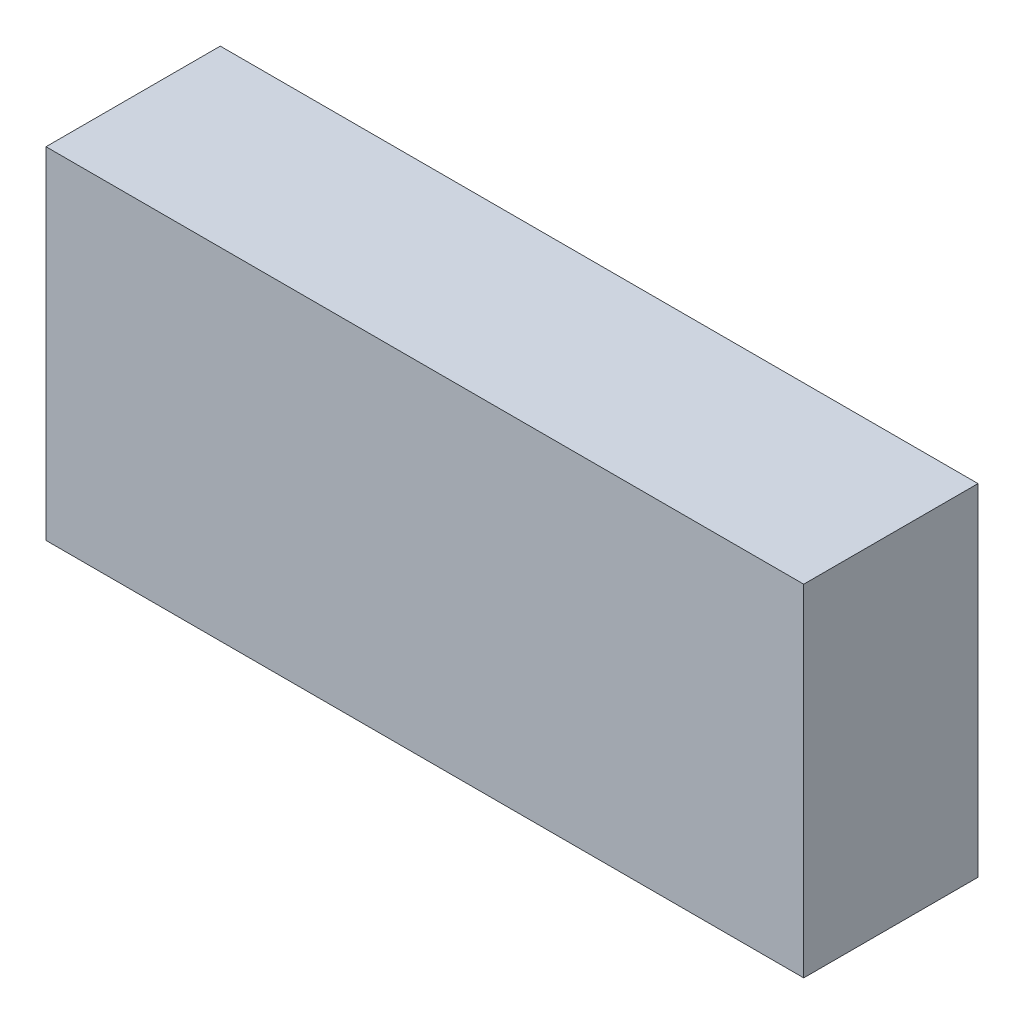
ISO-10303-21;
HEADER;
FILE_DESCRIPTION(('STEP AP214'),'2;1');
FILE_NAME('part.step','',(''),(''),'','','');
FILE_SCHEMA(('AUTOMOTIVE_DESIGN { 1 0 10303 214 1 1 1 1 }'));
ENDSEC;
DATA;
#1=APPLICATION_CONTEXT('core data for automotive mechanical design processes');
#2=APPLICATION_PROTOCOL_DEFINITION('international standard','automotive_design',2000,#1);
#3=PRODUCT_CONTEXT('',#1,'mechanical');
#4=PRODUCT('Part','Part','',(#3));
#5=PRODUCT_RELATED_PRODUCT_CATEGORY('part','',(#4));
#6=PRODUCT_DEFINITION_FORMATION('','',#4);
#7=PRODUCT_DEFINITION_CONTEXT('part definition',#1,'design');
#8=PRODUCT_DEFINITION('design','',#6,#7);
#9=PRODUCT_DEFINITION_SHAPE('','',#8);
#10=(LENGTH_UNIT() NAMED_UNIT(*) SI_UNIT(.MILLI.,.METRE.));
#11=(NAMED_UNIT(*) PLANE_ANGLE_UNIT() SI_UNIT($,.RADIAN.));
#12=(NAMED_UNIT(*) SI_UNIT($,.STERADIAN.) SOLID_ANGLE_UNIT());
#13=UNCERTAINTY_MEASURE_WITH_UNIT(LENGTH_MEASURE(1.E-05),#10,'distance_accuracy_value','');
#14=(GEOMETRIC_REPRESENTATION_CONTEXT(3) GLOBAL_UNCERTAINTY_ASSIGNED_CONTEXT((#13)) GLOBAL_UNIT_ASSIGNED_CONTEXT((#10,
#11,#12)) REPRESENTATION_CONTEXT('',''));
#15=CARTESIAN_POINT('',(0.,0.,0.));
#16=DIRECTION('',(0.,0.,1.));
#17=DIRECTION('',(1.,0.,0.));
#18=AXIS2_PLACEMENT_3D('',#15,#16,#17);
#19=CARTESIAN_POINT('',(-0.3302,-1.5367,0.635));
#20=DIRECTION('',(0.,0.,1.));
#21=DIRECTION('',(1.,0.,0.));
#22=AXIS2_PLACEMENT_3D('',#19,#20,#21);
#23=PLANE('',#22);
#24=DIRECTION('',(0.,1.,0.));
#25=VECTOR('',#24,1.);
#26=CARTESIAN_POINT('',(2.2098,-1.5367,0.635));
#27=LINE('',#26,#25);
#28=CARTESIAN_POINT('',(2.2098,-0.3937,0.635));
#29=VERTEX_POINT('',#28);
#30=CARTESIAN_POINT('',(2.2098,-1.5367,0.635));
#31=VERTEX_POINT('',#30);
#32=EDGE_CURVE('E76',#29,#31,#27,.F.);
#33=ORIENTED_EDGE('',*,*,#32,.F.);
#34=DIRECTION('',(1.,0.,0.));
#35=VECTOR('',#34,1.);
#36=CARTESIAN_POINT('',(-0.3302,-0.3937,0.635));
#37=LINE('',#36,#35);
#38=CARTESIAN_POINT('',(-0.3302,-0.3937,0.635));
#39=VERTEX_POINT('',#38);
#40=EDGE_CURVE('E58',#39,#29,#37,.T.);
#41=ORIENTED_EDGE('',*,*,#40,.F.);
#42=DIRECTION('',(0.,1.,0.));
#43=VECTOR('',#42,1.);
#44=CARTESIAN_POINT('',(-0.3302,-1.5367,0.635));
#45=LINE('',#44,#43);
#46=CARTESIAN_POINT('',(-0.3302,-1.5367,0.635));
#47=VERTEX_POINT('',#46);
#48=EDGE_CURVE('E20',#39,#47,#45,.F.);
#49=ORIENTED_EDGE('',*,*,#48,.T.);
#50=DIRECTION('',(1.,0.,0.));
#51=VECTOR('',#50,1.);
#52=CARTESIAN_POINT('',(-0.3302,-1.5367,0.635));
#53=LINE('',#52,#51);
#54=EDGE_CURVE('E55',#47,#31,#53,.T.);
#55=ORIENTED_EDGE('',*,*,#54,.T.);
#56=EDGE_LOOP('',(#33,#41,#49,#55));
#57=FACE_BOUND('',#56,.T.);
#58=ADVANCED_FACE('F17',(#57),#23,.T.);
#59=CARTESIAN_POINT('',(-0.3302,-1.5367,0.0508));
#60=DIRECTION('',(1.,0.,0.));
#61=DIRECTION('',(0.,0.,-1.));
#62=AXIS2_PLACEMENT_3D('',#59,#60,#61);
#63=PLANE('',#62);
#64=DIRECTION('',(0.,0.,1.));
#65=VECTOR('',#64,1.);
#66=CARTESIAN_POINT('',(-0.3302,-0.3937,0.0508));
#67=LINE('',#66,#65);
#68=CARTESIAN_POINT('',(-0.3302,-0.3937,0.0508));
#69=VERTEX_POINT('',#68);
#70=EDGE_CURVE('E78',#69,#39,#67,.T.);
#71=ORIENTED_EDGE('',*,*,#70,.F.);
#72=DIRECTION('',(0.,1.,0.));
#73=VECTOR('',#72,1.);
#74=CARTESIAN_POINT('',(-0.3302,-1.5367,0.0508));
#75=LINE('',#74,#73);
#76=CARTESIAN_POINT('',(-0.3302,-1.5367,0.0508));
#77=VERTEX_POINT('',#76);
#78=EDGE_CURVE('E73',#69,#77,#75,.F.);
#79=ORIENTED_EDGE('',*,*,#78,.T.);
#80=DIRECTION('',(0.,0.,1.));
#81=VECTOR('',#80,1.);
#82=CARTESIAN_POINT('',(-0.3302,-1.5367,0.0508));
#83=LINE('',#82,#81);
#84=EDGE_CURVE('E63',#77,#47,#83,.T.);
#85=ORIENTED_EDGE('',*,*,#84,.T.);
#86=ORIENTED_EDGE('',*,*,#48,.F.);
#87=EDGE_LOOP('',(#71,#79,#85,#86));
#88=FACE_BOUND('',#87,.T.);
#89=ADVANCED_FACE('F72',(#88),#63,.F.);
#90=CARTESIAN_POINT('',(-0.3302,-1.5367,0.0508));
#91=DIRECTION('',(0.,1.,0.));
#92=DIRECTION('',(0.,0.,1.));
#93=AXIS2_PLACEMENT_3D('',#90,#91,#92);
#94=PLANE('',#93);
#95=ORIENTED_EDGE('',*,*,#54,.F.);
#96=ORIENTED_EDGE('',*,*,#84,.F.);
#97=DIRECTION('',(1.,0.,0.));
#98=VECTOR('',#97,1.);
#99=CARTESIAN_POINT('',(-0.3302,-1.5367,0.0508));
#100=LINE('',#99,#98);
#101=CARTESIAN_POINT('',(2.2098,-1.5367,0.0508));
#102=VERTEX_POINT('',#101);
#103=EDGE_CURVE('E83',#77,#102,#100,.T.);
#104=ORIENTED_EDGE('',*,*,#103,.T.);
#105=DIRECTION('',(0.,0.,-1.));
#106=VECTOR('',#105,1.);
#107=CARTESIAN_POINT('',(2.2098,-1.5367,0.0508));
#108=LINE('',#107,#106);
#109=EDGE_CURVE('E69',#31,#102,#108,.T.);
#110=ORIENTED_EDGE('',*,*,#109,.F.);
#111=EDGE_LOOP('',(#95,#96,#104,#110));
#112=FACE_BOUND('',#111,.T.);
#113=ADVANCED_FACE('F66',(#112),#94,.F.);
#114=CARTESIAN_POINT('',(2.2098,-1.5367,0.0508));
#115=DIRECTION('',(1.,0.,0.));
#116=DIRECTION('',(0.,0.,-1.));
#117=AXIS2_PLACEMENT_3D('',#114,#115,#116);
#118=PLANE('',#117);
#119=DIRECTION('',(0.,0.,1.));
#120=VECTOR('',#119,1.);
#121=CARTESIAN_POINT('',(2.2098,-0.3937,0.0508));
#122=LINE('',#121,#120);
#123=CARTESIAN_POINT('',(2.2098,-0.3937,0.0508));
#124=VERTEX_POINT('',#123);
#125=EDGE_CURVE('E34',#29,#124,#122,.F.);
#126=ORIENTED_EDGE('',*,*,#125,.F.);
#127=ORIENTED_EDGE('',*,*,#32,.T.);
#128=ORIENTED_EDGE('',*,*,#109,.T.);
#129=DIRECTION('',(0.,1.,0.));
#130=VECTOR('',#129,1.);
#131=CARTESIAN_POINT('',(2.2098,-1.5367,0.0508));
#132=LINE('',#131,#130);
#133=EDGE_CURVE('E26',#102,#124,#132,.T.);
#134=ORIENTED_EDGE('',*,*,#133,.T.);
#135=EDGE_LOOP('',(#126,#127,#128,#134));
#136=FACE_BOUND('',#135,.T.);
#137=ADVANCED_FACE('F88',(#136),#118,.T.);
#138=CARTESIAN_POINT('',(-0.3302,-0.3937,0.0508));
#139=DIRECTION('',(0.,1.,0.));
#140=DIRECTION('',(0.,0.,1.));
#141=AXIS2_PLACEMENT_3D('',#138,#139,#140);
#142=PLANE('',#141);
#143=ORIENTED_EDGE('',*,*,#40,.T.);
#144=ORIENTED_EDGE('',*,*,#125,.T.);
#145=DIRECTION('',(1.,0.,0.));
#146=VECTOR('',#145,1.);
#147=CARTESIAN_POINT('',(-0.3302,-0.3937,0.0508));
#148=LINE('',#147,#146);
#149=EDGE_CURVE('E11',#124,#69,#148,.F.);
#150=ORIENTED_EDGE('',*,*,#149,.T.);
#151=ORIENTED_EDGE('',*,*,#70,.T.);
#152=EDGE_LOOP('',(#143,#144,#150,#151));
#153=FACE_BOUND('',#152,.T.);
#154=ADVANCED_FACE('F91',(#153),#142,.T.);
#155=CARTESIAN_POINT('',(-0.3302,-1.5367,0.0508));
#156=DIRECTION('',(0.,0.,1.));
#157=DIRECTION('',(1.,0.,0.));
#158=AXIS2_PLACEMENT_3D('',#155,#156,#157);
#159=PLANE('',#158);
#160=ORIENTED_EDGE('',*,*,#133,.F.);
#161=ORIENTED_EDGE('',*,*,#103,.F.);
#162=ORIENTED_EDGE('',*,*,#78,.F.);
#163=ORIENTED_EDGE('',*,*,#149,.F.);
#164=EDGE_LOOP('',(#160,#161,#162,#163));
#165=FACE_BOUND('',#164,.T.);
#166=ADVANCED_FACE('F90',(#165),#159,.F.);
#167=CLOSED_SHELL('',(#58,#89,#113,#137,#154,#166));
#168=MANIFOLD_SOLID_BREP('B1',#167);
#169=ADVANCED_BREP_SHAPE_REPRESENTATION('',(#18,#168),#14);
#170=SHAPE_DEFINITION_REPRESENTATION(#9,#169);
ENDSEC;
END-ISO-10303-21;
